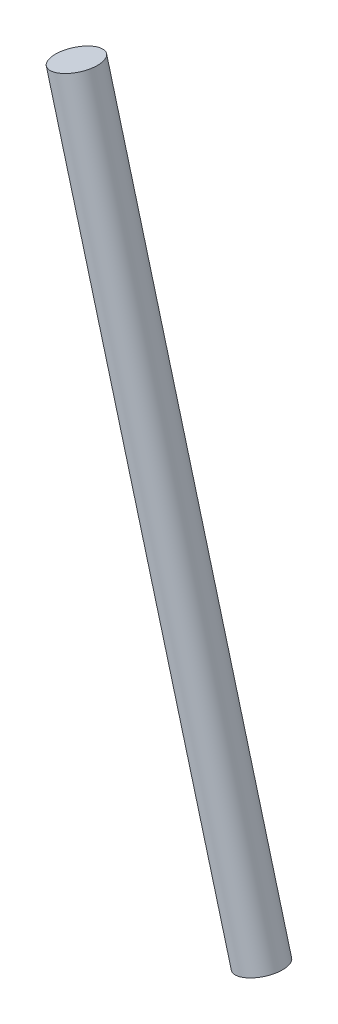
ISO-10303-21;
HEADER;
FILE_DESCRIPTION(('STEP AP214'),'2;1');
FILE_NAME('part.step','',(''),(''),'','','');
FILE_SCHEMA(('AUTOMOTIVE_DESIGN { 1 0 10303 214 1 1 1 1 }'));
ENDSEC;
DATA;
#1=APPLICATION_CONTEXT('core data for automotive mechanical design processes');
#2=APPLICATION_PROTOCOL_DEFINITION('international standard','automotive_design',2000,#1);
#3=PRODUCT_CONTEXT('',#1,'mechanical');
#4=PRODUCT('Part','Part','',(#3));
#5=PRODUCT_RELATED_PRODUCT_CATEGORY('part','',(#4));
#6=PRODUCT_DEFINITION_FORMATION('','',#4);
#7=PRODUCT_DEFINITION_CONTEXT('part definition',#1,'design');
#8=PRODUCT_DEFINITION('design','',#6,#7);
#9=PRODUCT_DEFINITION_SHAPE('','',#8);
#10=(LENGTH_UNIT() NAMED_UNIT(*) SI_UNIT(.MILLI.,.METRE.));
#11=(NAMED_UNIT(*) PLANE_ANGLE_UNIT() SI_UNIT($,.RADIAN.));
#12=(NAMED_UNIT(*) SI_UNIT($,.STERADIAN.) SOLID_ANGLE_UNIT());
#13=UNCERTAINTY_MEASURE_WITH_UNIT(LENGTH_MEASURE(1.E-05),#10,'distance_accuracy_value','');
#14=(GEOMETRIC_REPRESENTATION_CONTEXT(3) GLOBAL_UNCERTAINTY_ASSIGNED_CONTEXT((#13)) GLOBAL_UNIT_ASSIGNED_CONTEXT((#10,
#11,#12)) REPRESENTATION_CONTEXT('',''));
#15=CARTESIAN_POINT('',(0.,0.,0.));
#16=DIRECTION('',(0.,0.,1.));
#17=DIRECTION('',(1.,0.,0.));
#18=AXIS2_PLACEMENT_3D('',#15,#16,#17);
#19=CARTESIAN_POINT('',(-173.638797222675,-105.019479683697,149.404692585149));
#20=DIRECTION('',(-0.258819045102521,0.965925826289068,0.));
#21=DIRECTION('',(0.25,0.0669872981077806,-0.965925826289068));
#22=AXIS2_PLACEMENT_3D('',#19,#20,#21);
#23=PLANE('',#22);
#24=CARTESIAN_POINT('',(-167.971782400443,-103.501007638585,151.000001559555));
#25=DIRECTION('',(-0.258819045102521,0.965925826289068,0.));
#26=DIRECTION('',(-0.965925826289068,-0.258819045102521,0.));
#27=AXIS2_PLACEMENT_3D('',#24,#25,#26);
#28=CIRCLE('',#27,3.5);
#29=CARTESIAN_POINT('',(-171.352522792456,-104.406874296444,151.000001559555));
#30=VERTEX_POINT('',#29);
#31=EDGE_CURVE('E10',#30,#30,#28,.T.);
#32=ORIENTED_EDGE('',*,*,#31,.F.);
#33=EDGE_LOOP('',(#32));
#34=FACE_BOUND('',#33,.T.);
#35=ADVANCED_FACE('F15',(#34),#23,.F.);
#36=CARTESIAN_POINT('',(-197.735972587234,7.58046238465807,151.000001559555));
#37=DIRECTION('',(0.258819045102521,-0.965925826289068,0.));
#38=DIRECTION('',(-0.25,-0.0669872981077806,0.965925826289068));
#39=AXIS2_PLACEMENT_3D('',#36,#37,#38);
#40=PLANE('',#39);
#41=CARTESIAN_POINT('',(-197.735972587234,7.58046238465811,151.000001559555));
#42=DIRECTION('',(0.258819045102521,-0.965925826289068,0.));
#43=DIRECTION('',(0.965925826289068,0.258819045102521,0.));
#44=AXIS2_PLACEMENT_3D('',#41,#42,#43);
#45=CIRCLE('',#44,3.5);
#46=CARTESIAN_POINT('',(-201.116712979246,6.67459572679918,151.000001559555));
#47=VERTEX_POINT('',#46);
#48=EDGE_CURVE('E21',#47,#47,#45,.T.);
#49=ORIENTED_EDGE('',*,*,#48,.F.);
#50=EDGE_LOOP('',(#49));
#51=FACE_BOUND('',#50,.T.);
#52=ADVANCED_FACE('F29',(#51),#40,.F.);
#53=CARTESIAN_POINT('',(42.7976350942214,-890.103182410373,151.000001559555));
#54=DIRECTION('',(-0.258819045102521,0.965925826289068,0.));
#55=DIRECTION('',(-0.965925826289068,-0.258819045102521,0.));
#56=AXIS2_PLACEMENT_3D('',#53,#54,#55);
#57=CYLINDRICAL_SURFACE('',#56,3.5);
#58=CARTESIAN_POINT('',(-171.352522792456,-104.406874296444,151.000001559555));
#59=CARTESIAN_POINT('',(-171.662566440235,-103.249775650368,151.000001559555));
#60=CARTESIAN_POINT('',(-171.972610088014,-102.092677004293,151.000001559555));
#61=CARTESIAN_POINT('',(-172.592697383572,-99.778479712142,151.000001559555));
#62=CARTESIAN_POINT('',(-172.902741031351,-98.6213810660666,151.000001559555));
#63=CARTESIAN_POINT('',(-173.522828326909,-96.3071837739157,151.000001559555));
#64=CARTESIAN_POINT('',(-173.832871974688,-95.1500851278403,151.000001559555));
#65=CARTESIAN_POINT('',(-174.452959270246,-92.8358878356894,151.000001559555));
#66=CARTESIAN_POINT('',(-174.763002918025,-91.6787891896139,151.000001559555));
#67=CARTESIAN_POINT('',(-175.383090213583,-89.364591897463,151.000001559555));
#68=CARTESIAN_POINT('',(-175.693133861362,-88.2074932513875,151.000001559555));
#69=CARTESIAN_POINT('',(-176.313221156921,-85.8932959592366,151.000001559555));
#70=CARTESIAN_POINT('',(-176.6232648047,-84.7361973131612,151.000001559555));
#71=CARTESIAN_POINT('',(-177.243352100258,-82.4220000210103,151.000001559555));
#72=CARTESIAN_POINT('',(-177.553395748037,-81.2649013749349,151.000001559555));
#73=CARTESIAN_POINT('',(-178.173483043595,-78.950704082784,151.000001559555));
#74=CARTESIAN_POINT('',(-178.483526691374,-77.7936054367085,151.000001559555));
#75=CARTESIAN_POINT('',(-179.103613986932,-75.4794081445576,151.000001559555));
#76=CARTESIAN_POINT('',(-179.413657634711,-74.3223094984821,151.000001559555));
#77=CARTESIAN_POINT('',(-180.033744930269,-72.0081122063313,151.000001559555));
#78=CARTESIAN_POINT('',(-180.343788578048,-70.8510135602559,151.000001559555));
#79=CARTESIAN_POINT('',(-180.963875873607,-68.536816268105,151.000001559555));
#80=CARTESIAN_POINT('',(-181.273919521386,-67.3797176220295,151.000001559555));
#81=CARTESIAN_POINT('',(-181.894006816944,-65.0655203298786,151.000001559555));
#82=CARTESIAN_POINT('',(-182.204050464723,-63.9084216838031,151.000001559555));
#83=CARTESIAN_POINT('',(-182.824137760281,-61.5942243916522,151.000001559555));
#84=CARTESIAN_POINT('',(-183.13418140806,-60.4371257455768,151.000001559555));
#85=CARTESIAN_POINT('',(-183.754268703618,-58.1229284534259,151.000001559555));
#86=CARTESIAN_POINT('',(-184.064312351397,-56.9658298073505,151.000001559555));
#87=CARTESIAN_POINT('',(-184.684399646955,-54.6516325151996,151.000001559555));
#88=CARTESIAN_POINT('',(-184.994443294734,-53.4945338691241,151.000001559555));
#89=CARTESIAN_POINT('',(-185.614530590292,-51.1803365769732,151.000001559555));
#90=CARTESIAN_POINT('',(-185.924574238072,-50.0232379308978,151.000001559555));
#91=CARTESIAN_POINT('',(-186.54466153363,-47.7090406387468,151.000001559555));
#92=CARTESIAN_POINT('',(-186.854705181409,-46.5519419926714,151.000001559555));
#93=CARTESIAN_POINT('',(-187.474792476967,-44.2377447005205,151.000001559555));
#94=CARTESIAN_POINT('',(-187.784836124746,-43.0806460544451,151.000001559555));
#95=CARTESIAN_POINT('',(-188.404923420304,-40.7664487622942,151.000001559555));
#96=CARTESIAN_POINT('',(-188.714967068083,-39.6093501162188,151.000001559555));
#97=CARTESIAN_POINT('',(-189.335054363641,-37.2951528240678,151.000001559555));
#98=CARTESIAN_POINT('',(-189.64509801142,-36.1380541779924,151.000001559555));
#99=CARTESIAN_POINT('',(-190.265185306978,-33.8238568858415,151.000001559555));
#100=CARTESIAN_POINT('',(-190.575228954757,-32.666758239766,151.000001559555));
#101=CARTESIAN_POINT('',(-191.195316250316,-30.3525609476151,151.000001559555));
#102=CARTESIAN_POINT('',(-191.505359898095,-29.1954623015397,151.000001559555));
#103=CARTESIAN_POINT('',(-192.125447193653,-26.8812650093888,151.000001559555));
#104=CARTESIAN_POINT('',(-192.435490841432,-25.7241663633134,151.000001559555));
#105=CARTESIAN_POINT('',(-193.05557813699,-23.4099690711625,151.000001559555));
#106=CARTESIAN_POINT('',(-193.365621784769,-22.252870425087,151.000001559555));
#107=CARTESIAN_POINT('',(-193.985709080327,-19.9386731329361,151.000001559555));
#108=CARTESIAN_POINT('',(-194.295752728106,-18.7815744868607,151.000001559555));
#109=CARTESIAN_POINT('',(-194.915840023664,-16.4673771947097,151.000001559555));
#110=CARTESIAN_POINT('',(-195.225883671443,-15.3102785486343,151.000001559555));
#111=CARTESIAN_POINT('',(-195.845970967001,-12.9960812564834,151.000001559555));
#112=CARTESIAN_POINT('',(-196.156014614781,-11.838982610408,151.000001559555));
#113=CARTESIAN_POINT('',(-196.776101910339,-9.52478531825711,151.000001559555));
#114=CARTESIAN_POINT('',(-197.086145558118,-8.36768667218165,151.000001559555));
#115=CARTESIAN_POINT('',(-197.706232853676,-6.05348938003073,151.000001559555));
#116=CARTESIAN_POINT('',(-198.016276501455,-4.89639073395528,151.000001559555));
#117=CARTESIAN_POINT('',(-198.636363797013,-2.58219344180437,151.000001559555));
#118=CARTESIAN_POINT('',(-198.946407444792,-1.42509479572891,151.000001559555));
#119=CARTESIAN_POINT('',(-199.56649474035,0.889102496421973,151.000001559555));
#120=CARTESIAN_POINT('',(-199.876538388129,2.04620114249739,151.000001559555));
#121=CARTESIAN_POINT('',(-200.496625683687,4.36039843464827,151.000001559555));
#122=CARTESIAN_POINT('',(-200.806669331466,5.51749708072372,151.000001559555));
#123=CARTESIAN_POINT('',(-201.116712979246,6.67459572679918,151.000001559555));
#124=B_SPLINE_CURVE_WITH_KNOTS('',3,(#58,#59,#60,#61,#62,#63,#64,#65,#66,#67,#68,#69,#70,#71,
#72,#73,#74,#75,#76,#77,#78,#79,#80,#81,#82,#83,#84,#85,#86,#87,#88,#89,#90,#91,#92,#93,#94,#95,
#96,#97,#98,#99,#100,#101,#102,#103,#104,#105,#106,#107,#108,#109,#110,#111,#112,#113,#114,#115,
#116,#117,#118,#119,#120,#121,#122,#123),.UNSPECIFIED.,.F.,.F.,(4,2,2,2,2,2,2,2,2,2,2,2,2,2,2,2,
2,2,2,2,2,2,2,2,2,2,2,2,2,2,2,2,4),(0.,3.59375000000003,7.18749999999995,10.7812499999999,
14.375,17.96875,21.5625,25.15625,28.75,32.3437500000001,35.9375,39.53125,43.125,
46.7187500000001,50.3125,53.90625,57.5000000000001,61.0937500000001,64.6875,68.2812500000001,
71.8750000000001,75.4687500000001,79.0625,82.6562500000001,86.2500000000001,89.8437500000001,
93.4375000000002,97.0312500000001,100.625,104.21875,107.8125,111.40625,115.),.UNSPECIFIED.);
#125=EDGE_CURVE('BSEAM27',#30,#47,#124,.T.);
#126=ORIENTED_EDGE('',*,*,#31,.T.);
#127=ORIENTED_EDGE('',*,*,#48,.T.);
#128=ORIENTED_EDGE('',*,*,#125,.T.);
#129=ORIENTED_EDGE('',*,*,#125,.F.);
#130=EDGE_LOOP('',(#126,#128,#127,#129));
#131=FACE_BOUND('',#130,.T.);
#132=ADVANCED_FACE('F27',(#131),#57,.T.);
#133=CLOSED_SHELL('',(#35,#52,#132));
#134=MANIFOLD_SOLID_BREP('B1',#133);
#135=ADVANCED_BREP_SHAPE_REPRESENTATION('',(#18,#134),#14);
#136=SHAPE_DEFINITION_REPRESENTATION(#9,#135);
ENDSEC;
END-ISO-10303-21;
